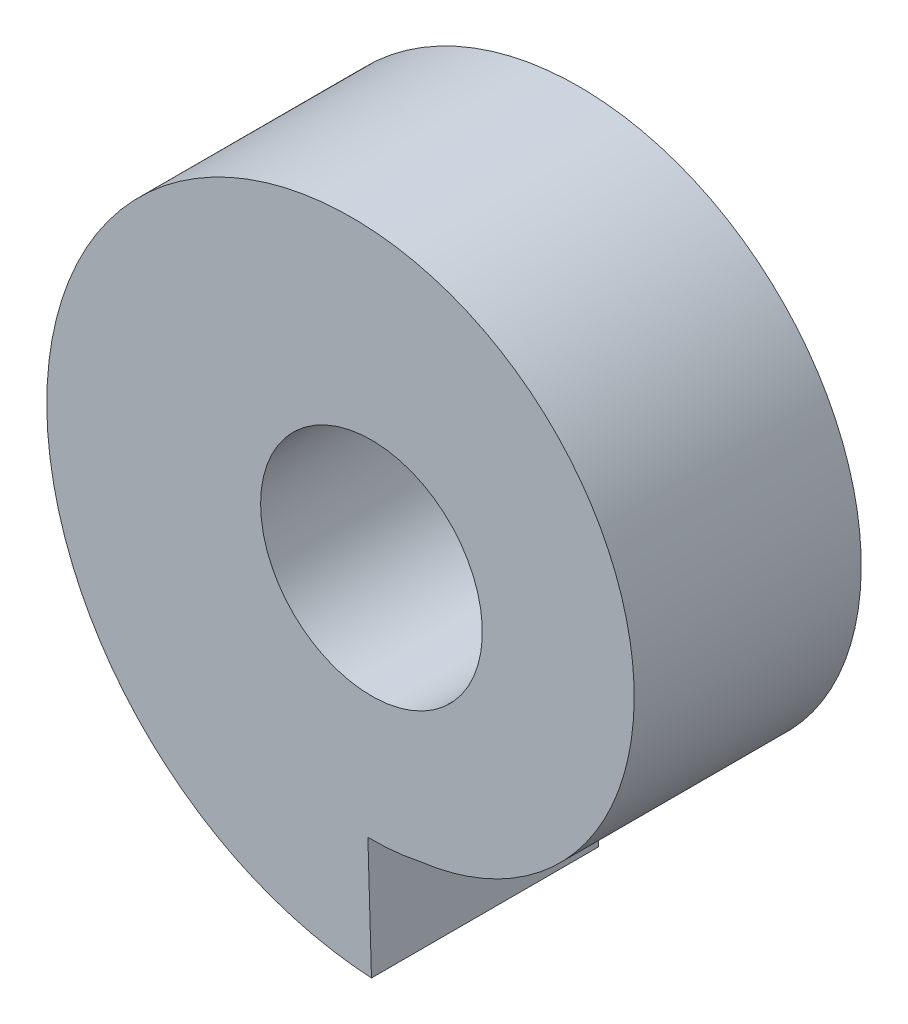
ISO-10303-21;
HEADER;
FILE_DESCRIPTION(('STEP AP214'),'2;1');
FILE_NAME('part.step','',(''),(''),'','','');
FILE_SCHEMA(('AUTOMOTIVE_DESIGN { 1 0 10303 214 1 1 1 1 }'));
ENDSEC;
DATA;
#1=APPLICATION_CONTEXT('core data for automotive mechanical design processes');
#2=APPLICATION_PROTOCOL_DEFINITION('international standard','automotive_design',2000,#1);
#3=PRODUCT_CONTEXT('',#1,'mechanical');
#4=PRODUCT('Part','Part','',(#3));
#5=PRODUCT_RELATED_PRODUCT_CATEGORY('part','',(#4));
#6=PRODUCT_DEFINITION_FORMATION('','',#4);
#7=PRODUCT_DEFINITION_CONTEXT('part definition',#1,'design');
#8=PRODUCT_DEFINITION('design','',#6,#7);
#9=PRODUCT_DEFINITION_SHAPE('','',#8);
#10=(LENGTH_UNIT() NAMED_UNIT(*) SI_UNIT(.MILLI.,.METRE.));
#11=(NAMED_UNIT(*) PLANE_ANGLE_UNIT() SI_UNIT($,.RADIAN.));
#12=(NAMED_UNIT(*) SI_UNIT($,.STERADIAN.) SOLID_ANGLE_UNIT());
#13=UNCERTAINTY_MEASURE_WITH_UNIT(LENGTH_MEASURE(1.E-05),#10,'distance_accuracy_value','');
#14=(GEOMETRIC_REPRESENTATION_CONTEXT(3) GLOBAL_UNCERTAINTY_ASSIGNED_CONTEXT((#13)) GLOBAL_UNIT_ASSIGNED_CONTEXT((#10,
#11,#12)) REPRESENTATION_CONTEXT('',''));
#15=CARTESIAN_POINT('',(0.,0.,0.));
#16=DIRECTION('',(0.,0.,1.));
#17=DIRECTION('',(1.,0.,0.));
#18=AXIS2_PLACEMENT_3D('',#15,#16,#17);
#19=CARTESIAN_POINT('',(-0.158316442824437,-26.1424127024881,0.));
#20=DIRECTION('',(-0.999556864278868,-0.0297670131688876,0.));
#21=DIRECTION('',(0.0297670131688876,-0.999556864278868,0.));
#22=AXIS2_PLACEMENT_3D('',#19,#20,#21);
#23=PLANE('',#22);
#24=DIRECTION('',(-0.0297670131688876,0.999556864278868,0.));
#25=VECTOR('',#24,1.);
#26=CARTESIAN_POINT('',(-0.158316442824437,-26.1424127024881,0.));
#27=LINE('',#26,#25);
#28=CARTESIAN_POINT('',(0.,-31.4585754715082,0.));
#29=VERTEX_POINT('',#28);
#30=CARTESIAN_POINT('',(-0.316632885648866,-20.826249933468,0.));
#31=VERTEX_POINT('',#30);
#32=EDGE_CURVE('E63',#29,#31,#27,.T.);
#33=ORIENTED_EDGE('',*,*,#32,.T.);
#34=DIRECTION('',(0.,0.,1.));
#35=VECTOR('',#34,1.);
#36=CARTESIAN_POINT('',(-0.316632885648866,-20.826249933468,10.0559952540488));
#37=LINE('',#36,#35);
#38=CARTESIAN_POINT('',(-0.316632885648866,-20.826249933468,20.1119905080975));
#39=VERTEX_POINT('',#38);
#40=EDGE_CURVE('E88',#31,#39,#37,.T.);
#41=ORIENTED_EDGE('',*,*,#40,.T.);
#42=DIRECTION('',(0.0297670131688876,-0.999556864278868,0.));
#43=VECTOR('',#42,1.);
#44=CARTESIAN_POINT('',(-0.158316442824437,-26.1424127024881,20.1119905080975));
#45=LINE('',#44,#43);
#46=CARTESIAN_POINT('',(0.,-31.4585754715082,20.1119905080975));
#47=VERTEX_POINT('',#46);
#48=EDGE_CURVE('E94',#39,#47,#45,.T.);
#49=ORIENTED_EDGE('',*,*,#48,.T.);
#50=DIRECTION('',(0.,0.,-1.));
#51=VECTOR('',#50,1.);
#52=CARTESIAN_POINT('',(0.,-31.4585754715082,10.0559952540488));
#53=LINE('',#52,#51);
#54=EDGE_CURVE('E105',#47,#29,#53,.T.);
#55=ORIENTED_EDGE('',*,*,#54,.T.);
#56=EDGE_LOOP('',(#33,#41,#49,#55));
#57=FACE_BOUND('',#56,.T.);
#58=ADVANCED_FACE('F55',(#57),#23,.F.);
#59=CARTESIAN_POINT('',(0.,-20.4585754715082,0.));
#60=DIRECTION('',(0.,0.,-1.));
#61=DIRECTION('',(0.,1.,0.));
#62=AXIS2_PLACEMENT_3D('',#59,#60,#61);
#63=PLANE('',#62);
#64=CARTESIAN_POINT('',(0.,0.,0.));
#65=DIRECTION('',(0.,0.,-1.));
#66=DIRECTION('',(-1.,0.,0.));
#67=AXIS2_PLACEMENT_3D('',#64,#65,#66);
#68=CIRCLE('',#67,9.82153628143578);
#69=CARTESIAN_POINT('',(-9.82153628143578,0.,0.));
#70=VERTEX_POINT('',#69);
#71=EDGE_CURVE('E91',#70,#70,#68,.T.);
#72=ORIENTED_EDGE('',*,*,#71,.F.);
#73=EDGE_LOOP('',(#72));
#74=FACE_BOUND('',#73,.T.);
#75=CARTESIAN_POINT('',(0.,-20.4585754715082,0.));
#76=CARTESIAN_POINT('',(1.33901062639354,-20.573158804314,0.));
#77=CARTESIAN_POINT('',(2.70063028049049,-20.5558502085192,0.));
#78=CARTESIAN_POINT('',(5.41603446935119,-20.2493790327056,0.));
#79=CARTESIAN_POINT('',(6.76974749594372,-19.9602018280232,0.));
#80=CARTESIAN_POINT('',(9.41475798903226,-19.1126508141075,0.));
#81=CARTESIAN_POINT('',(10.7059814424062,-18.554277039971,0.));
#82=CARTESIAN_POINT('',(13.1722332471065,-17.1819966665176,0.));
#83=CARTESIAN_POINT('',(14.3471880889535,-16.3681051587507,0.));
#84=CARTESIAN_POINT('',(16.53015045795,-14.5092333881527,0.));
#85=CARTESIAN_POINT('',(17.5380880452848,-13.4642830544328,0.));
#86=CARTESIAN_POINT('',(19.3414563781198,-11.1778407054819,0.));
#87=CARTESIAN_POINT('',(20.1368237481293,-9.93639261384188,0.));
#88=CARTESIAN_POINT('',(21.4766976084074,-7.3004923101381,0.));
#89=CARTESIAN_POINT('',(22.0211500838885,-5.90609656947934,0.));
#90=CARTESIAN_POINT('',(22.8298184389997,-3.01531575867887,0.));
#91=CARTESIAN_POINT('',(23.0939921413775,-1.51899770384918,0.));
#92=CARTESIAN_POINT('',(23.3231588016389,1.51899770384918,0.));
#93=CARTESIAN_POINT('',(23.2881234664431,3.06059998804408,0.));
#94=CARTESIAN_POINT('',(22.9114248169995,6.1290615328863,0.));
#95=CARTESIAN_POINT('',(22.5697486152794,7.65584055623232,0.));
#96=CARTESIAN_POINT('',(21.5844414556634,10.6334238067516,0.));
#97=CARTESIAN_POINT('',(20.940813936978,12.0841457960559,0.));
#98=CARTESIAN_POINT('',(19.3685426371745,14.8497051750646,0.));
#99=CARTESIAN_POINT('',(18.4399188909367,16.1644616527378,0.));
#100=CARTESIAN_POINT('',(16.3265069524927,18.6019641906916,0.));
#101=CARTESIAN_POINT('',(15.1417549819537,19.7246340152877,0.));
#102=CARTESIAN_POINT('',(12.5560050595688,21.7279932757808,0.));
#103=CARTESIAN_POINT('',(11.1550584312557,22.6086143889621,0.));
#104=CARTESIAN_POINT('',(8.18658537073227,24.0862443963868,0.));
#105=CARTESIAN_POINT('',(6.61912363285514,24.6831958674133,0.));
#106=CARTESIAN_POINT('',(3.37528546639179,25.5620916976927,0.));
#107=CARTESIAN_POINT('',(1.69898478300544,25.8439921410264,0.));
#108=CARTESIAN_POINT('',(-1.69898478300543,26.07315880199,0.));
#109=CARTESIAN_POINT('',(-3.42056969562371,26.0203967244553,0.));
#110=CARTESIAN_POINT('',(-6.84208859639539,25.573470601205,0.));
#111=CARTESIAN_POINT('',(-8.54193361656526,25.1792954026169,0.));
#112=CARTESIAN_POINT('',(-11.8520896244267,24.056232097138,0.));
#113=CARTESIAN_POINT('',(-13.4623101497582,23.3273508340499,0.));
#114=CARTESIAN_POINT('',(-16.5271771029702,21.5550886077667,0.));
#115=CARTESIAN_POINT('',(-17.9817352165892,20.5117326231733,0.));
#116=CARTESIAN_POINT('',(-20.6737779233663,18.1437805167821,0.));
#117=CARTESIAN_POINT('',(-21.9111799853602,16.8192269095097,0.));
#118=CARTESIAN_POINT('',(-24.1145301733723,13.9341694136206,0.));
#119=CARTESIAN_POINT('',(-25.0804050298658,12.3737242486892,0.));
#120=CARTESIAN_POINT('',(-26.6957911842951,9.07267843130676,0.));
#121=CARTESIAN_POINT('',(-27.3452416510114,7.33215069623305,0.));
#122=CARTESIAN_POINT('',(-28.2943649563123,3.7352551741026,0.));
#123=CARTESIAN_POINT('',(-28.5939921407521,1.87897186215318,0.));
#124=CARTESIAN_POINT('',(-28.8231588022643,-1.87897186215317,0.));
#125=CARTESIAN_POINT('',(-28.7526699825232,-3.78053940322552,0.));
#126=CARTESIAN_POINT('',(-28.2355163853549,-7.55511565988227,0.));
#127=CARTESIAN_POINT('',(-27.7888421900004,-9.42802667692492,0.));
#128=CARTESIAN_POINT('',(-26.5280227385665,-13.070755442075,0.));
#129=CARTESIAN_POINT('',(-25.7138877311699,-14.8404745035027,0.));
#130=CARTESIAN_POINT('',(-23.7416345783107,-18.2046490308334,0.));
#131=CARTESIAN_POINT('',(-22.5835463554478,-19.7990087804829,0.));
#132=CARTESIAN_POINT('',(-19.9610540810337,-22.7455916559985,0.));
#133=CARTESIAN_POINT('',(-18.4966988370923,-24.0977259554937,0.));
#134=CARTESIAN_POINT('',(-15.3123337676459,-26.5010670709028,0.));
#135=CARTESIAN_POINT('',(-13.5923900661369,-27.5521956708191,0.));
#136=CARTESIAN_POINT('',(-9.95877149186708,-29.3053379721539,0.));
#137=CARTESIAN_POINT('',(-8.0451777596185,-30.007287434663,0.));
#138=CARTESIAN_POINT('',(-4.09522488180585,-31.0266382148785,0.));
#139=CARTESIAN_POINT('',(-2.05895894374013,-31.3439921383429,0.));
#140=CARTESIAN_POINT('',(0.,-31.4585754715082,0.));
#141=B_SPLINE_CURVE_WITH_KNOTS('',3,(#75,#76,#77,#78,#79,#80,#81,#82,#83,#84,#85,#86,#87,#88,
#89,#90,#91,#92,#93,#94,#95,#96,#97,#98,#99,#100,#101,#102,#103,#104,#105,#106,#107,#108,#109,
#110,#111,#112,#113,#114,#115,#116,#117,#118,#119,#120,#121,#122,#123,#124,#125,#126,#127,#128,
#129,#130,#131,#132,#133,#134,#135,#136,#137,#138,#139,#140),.UNSPECIFIED.,.F.,.F.,(4,2,2,2,2,2,
2,2,2,2,2,2,2,2,2,2,2,2,2,2,2,2,2,2,2,2,2,2,2,2,2,2,4),(0.,0.03125,0.0625,0.09375,0.125,0.15625,
0.1875,0.21875,0.25,0.28125,0.3125,0.34375,0.375,0.40625,0.4375,0.46875,0.5,0.53125,0.5625,
0.59375,0.625,0.65625,0.6875,0.71875,0.75,0.78125,0.8125,0.84375,0.875,0.90625,0.9375,0.96875,
1.),.UNSPECIFIED.);
#142=CARTESIAN_POINT('',(4.37032876876348,-20.3649986282462,0.));
#143=VERTEX_POINT('',#142);
#144=EDGE_CURVE('E107',#143,#29,#141,.T.);
#145=ORIENTED_EDGE('',*,*,#144,.F.);
#146=CARTESIAN_POINT('',(0.,0.,0.));
#147=DIRECTION('',(0.,0.,-1.));
#148=DIRECTION('',(-1.,0.,0.));
#149=AXIS2_PLACEMENT_3D('',#146,#147,#148);
#150=CIRCLE('',#149,20.8286567659931);
#151=EDGE_CURVE('E125',#143,#31,#150,.T.);
#152=ORIENTED_EDGE('',*,*,#151,.T.);
#153=ORIENTED_EDGE('',*,*,#32,.F.);
#154=EDGE_LOOP('',(#145,#152,#153));
#155=FACE_BOUND('',#154,.T.);
#156=ADVANCED_FACE('F124',(#74,#155),#63,.T.);
#157=CARTESIAN_POINT('',(0.,-9.82153628143578,20.1119905080975));
#158=DIRECTION('',(0.,0.,1.));
#159=DIRECTION('',(0.,-1.,0.));
#160=AXIS2_PLACEMENT_3D('',#157,#158,#159);
#161=PLANE('',#160);
#162=ORIENTED_EDGE('',*,*,#48,.F.);
#163=CARTESIAN_POINT('',(0.,0.,20.1119905080975));
#164=DIRECTION('',(0.,0.,1.));
#165=DIRECTION('',(1.,0.,0.));
#166=AXIS2_PLACEMENT_3D('',#163,#164,#165);
#167=CIRCLE('',#166,20.8286567659931);
#168=CARTESIAN_POINT('',(4.37032876876415,-20.3649986282461,20.1119905080975));
#169=VERTEX_POINT('',#168);
#170=EDGE_CURVE('E70',#169,#39,#167,.F.);
#171=ORIENTED_EDGE('',*,*,#170,.F.);
#172=CARTESIAN_POINT('',(0.,-20.4585754715082,20.1119905080975));
#173=CARTESIAN_POINT('',(1.33901062639354,-20.573158804314,20.1119905080975));
#174=CARTESIAN_POINT('',(2.70063028049049,-20.5558502085192,20.1119905080975));
#175=CARTESIAN_POINT('',(5.41603446935119,-20.2493790327056,20.1119905080975));
#176=CARTESIAN_POINT('',(6.76974749594372,-19.9602018280233,20.1119905080975));
#177=CARTESIAN_POINT('',(9.41475798903226,-19.1126508141075,20.1119905080975));
#178=CARTESIAN_POINT('',(10.7059814424062,-18.5542770399685,20.1119905080975));
#179=CARTESIAN_POINT('',(13.1722332471065,-17.18199666652,20.1119905080975));
#180=CARTESIAN_POINT('',(14.3471880889535,-16.3681051587507,20.1119905080975));
#181=CARTESIAN_POINT('',(16.53015045795,-14.5092333881527,20.1119905080975));
#182=CARTESIAN_POINT('',(17.5380880452848,-13.4642830544328,20.1119905080975));
#183=CARTESIAN_POINT('',(19.3414563781198,-11.1778407054819,20.1119905080975));
#184=CARTESIAN_POINT('',(20.1368237481294,-9.93639261383931,20.1119905080975));
#185=CARTESIAN_POINT('',(21.4766976084074,-7.30049231014066,20.1119905080975));
#186=CARTESIAN_POINT('',(22.0211500838885,-5.90609656947999,20.1119905080975));
#187=CARTESIAN_POINT('',(22.8298184389997,-3.01531575867822,20.1119905080975));
#188=CARTESIAN_POINT('',(23.0939921413775,-1.5189977038492,20.1119905080975));
#189=CARTESIAN_POINT('',(23.3231588016389,1.5189977038492,20.1119905080975));
#190=CARTESIAN_POINT('',(23.2881234664431,3.06059998804342,20.1119905080975));
#191=CARTESIAN_POINT('',(22.9114248169995,6.12906153288697,20.1119905080975));
#192=CARTESIAN_POINT('',(22.5697486152794,7.65584055623232,20.1119905080975));
#193=CARTESIAN_POINT('',(21.5844414556634,10.6334238067516,20.1119905080975));
#194=CARTESIAN_POINT('',(20.940813936978,12.0841457960546,20.1119905080975));
#195=CARTESIAN_POINT('',(19.3685426371745,14.849705175066,20.1119905080975));
#196=CARTESIAN_POINT('',(18.439918890934,16.1644616527378,20.1119905080975));
#197=CARTESIAN_POINT('',(16.3265069524955,18.6019641906916,20.1119905080975));
#198=CARTESIAN_POINT('',(15.1417549819537,19.7246340152877,20.1119905080975));
#199=CARTESIAN_POINT('',(12.5560050595688,21.7279932757808,20.1119905080975));
#200=CARTESIAN_POINT('',(11.1550584312557,22.608614388965,20.1119905080975));
#201=CARTESIAN_POINT('',(8.18658537073227,24.0862443963839,20.1119905080975));
#202=CARTESIAN_POINT('',(6.61912363285441,24.6831958674133,20.1119905080975));
#203=CARTESIAN_POINT('',(3.37528546639252,25.5620916976927,20.1119905080975));
#204=CARTESIAN_POINT('',(1.69898478300544,25.8439921410264,20.1119905080975));
#205=CARTESIAN_POINT('',(-1.69898478300543,26.07315880199,20.1119905080975));
#206=CARTESIAN_POINT('',(-3.42056969562371,26.0203967244554,20.1119905080975));
#207=CARTESIAN_POINT('',(-6.84208859639539,25.573470601205,20.1119905080975));
#208=CARTESIAN_POINT('',(-8.54193361656526,25.1792954026169,20.1119905080975));
#209=CARTESIAN_POINT('',(-11.8520896244267,24.056232097138,20.1119905080975));
#210=CARTESIAN_POINT('',(-13.4623101497567,23.3273508340499,20.1119905080975));
#211=CARTESIAN_POINT('',(-16.5271771029717,21.5550886077667,20.1119905080975));
#212=CARTESIAN_POINT('',(-17.9817352165892,20.5117326231702,20.1119905080975));
#213=CARTESIAN_POINT('',(-20.6737779233663,18.1437805167853,20.1119905080975));
#214=CARTESIAN_POINT('',(-21.9111799853634,16.8192269095097,20.1119905080975));
#215=CARTESIAN_POINT('',(-24.1145301733692,13.9341694136207,20.1119905080975));
#216=CARTESIAN_POINT('',(-25.0804050298659,12.3737242486908,20.1119905080975));
#217=CARTESIAN_POINT('',(-26.6957911842951,9.07267843130517,20.1119905080975));
#218=CARTESIAN_POINT('',(-27.3452416510114,7.33215069623385,20.1119905080975));
#219=CARTESIAN_POINT('',(-28.2943649563123,3.73525517410179,20.1119905080975));
#220=CARTESIAN_POINT('',(-28.5939921407521,1.87897186215318,20.1119905080975));
#221=CARTESIAN_POINT('',(-28.8231588022643,-1.87897186215317,20.1119905080975));
#222=CARTESIAN_POINT('',(-28.7526699825232,-3.78053940322552,20.1119905080975));
#223=CARTESIAN_POINT('',(-28.2355163853549,-7.55511565988227,20.1119905080975));
#224=CARTESIAN_POINT('',(-27.7888421900004,-9.42802667692325,20.1119905080975));
#225=CARTESIAN_POINT('',(-26.5280227385665,-13.0707554420767,20.1119905080975));
#226=CARTESIAN_POINT('',(-25.7138877311665,-14.8404745035061,20.1119905080975));
#227=CARTESIAN_POINT('',(-23.7416345783141,-18.2046490308301,20.1119905080975));
#228=CARTESIAN_POINT('',(-22.5835463554444,-19.7990087804863,20.1119905080975));
#229=CARTESIAN_POINT('',(-19.9610540810371,-22.7455916559951,20.1119905080975));
#230=CARTESIAN_POINT('',(-18.4966988370923,-24.0977259554937,20.1119905080975));
#231=CARTESIAN_POINT('',(-15.3123337676459,-26.5010670709028,20.1119905080975));
#232=CARTESIAN_POINT('',(-13.5923900661369,-27.5521956708191,20.1119905080975));
#233=CARTESIAN_POINT('',(-9.95877149186708,-29.3053379721539,20.1119905080975));
#234=CARTESIAN_POINT('',(-8.04517775961762,-30.007287434663,20.1119905080975));
#235=CARTESIAN_POINT('',(-4.09522488180674,-31.0266382148785,20.1119905080975));
#236=CARTESIAN_POINT('',(-2.05895894373947,-31.3439921383429,20.1119905080975));
#237=CARTESIAN_POINT('',(0.,-31.4585754715082,20.1119905080975));
#238=B_SPLINE_CURVE_WITH_KNOTS('',3,(#172,#173,#174,#175,#176,#177,#178,#179,#180,#181,#182,
#183,#184,#185,#186,#187,#188,#189,#190,#191,#192,#193,#194,#195,#196,#197,#198,#199,#200,#201,
#202,#203,#204,#205,#206,#207,#208,#209,#210,#211,#212,#213,#214,#215,#216,#217,#218,#219,#220,
#221,#222,#223,#224,#225,#226,#227,#228,#229,#230,#231,#232,#233,#234,#235,#236,#237),
.UNSPECIFIED.,.F.,.F.,(4,2,2,2,2,2,2,2,2,2,2,2,2,2,2,2,2,2,2,2,2,2,2,2,2,2,2,2,2,2,2,2,4),(0.,
0.03125,0.0625,0.09375,0.125,0.15625,0.1875,0.21875,0.25,0.28125,0.3125,0.34375,0.375,0.40625,
0.4375,0.46875,0.5,0.53125,0.5625,0.59375,0.625,0.65625,0.6875,0.71875,0.75,0.78125,0.8125,
0.84375,0.875,0.90625,0.9375,0.96875,1.),.UNSPECIFIED.);
#239=EDGE_CURVE('E73',#169,#47,#238,.T.);
#240=ORIENTED_EDGE('',*,*,#239,.T.);
#241=EDGE_LOOP('',(#162,#171,#240));
#242=FACE_BOUND('',#241,.T.);
#243=CARTESIAN_POINT('',(0.,0.,20.1119905080975));
#244=DIRECTION('',(0.,0.,1.));
#245=DIRECTION('',(1.,0.,0.));
#246=AXIS2_PLACEMENT_3D('',#243,#244,#245);
#247=CIRCLE('',#246,9.82153628143578);
#248=CARTESIAN_POINT('',(-9.82153628143578,0.,20.1119905080975));
#249=VERTEX_POINT('',#248);
#250=EDGE_CURVE('E108',#249,#249,#247,.F.);
#251=ORIENTED_EDGE('',*,*,#250,.T.);
#252=EDGE_LOOP('',(#251));
#253=FACE_BOUND('',#252,.T.);
#254=ADVANCED_FACE('F57',(#242,#253),#161,.T.);
#255=CARTESIAN_POINT('',(0.,-20.4585754715082,20.1119905080975));
#256=CARTESIAN_POINT('',(1.33901062639354,-20.573158804314,20.1119905080975));
#257=CARTESIAN_POINT('',(2.70063028049049,-20.5558502085192,20.1119905080975));
#258=CARTESIAN_POINT('',(5.41603446935119,-20.2493790327056,20.1119905080975));
#259=CARTESIAN_POINT('',(6.76974749594372,-19.9602018280233,20.1119905080975));
#260=CARTESIAN_POINT('',(9.41475798903226,-19.1126508141075,20.1119905080975));
#261=CARTESIAN_POINT('',(10.7059814424062,-18.5542770399685,20.1119905080975));
#262=CARTESIAN_POINT('',(13.1722332471065,-17.18199666652,20.1119905080975));
#263=CARTESIAN_POINT('',(14.3471880889535,-16.3681051587507,20.1119905080975));
#264=CARTESIAN_POINT('',(16.53015045795,-14.5092333881527,20.1119905080975));
#265=CARTESIAN_POINT('',(17.5380880452848,-13.4642830544328,20.1119905080975));
#266=CARTESIAN_POINT('',(19.3414563781198,-11.1778407054819,20.1119905080975));
#267=CARTESIAN_POINT('',(20.1368237481294,-9.93639261383931,20.1119905080975));
#268=CARTESIAN_POINT('',(21.4766976084074,-7.30049231014066,20.1119905080975));
#269=CARTESIAN_POINT('',(22.0211500838885,-5.90609656947999,20.1119905080975));
#270=CARTESIAN_POINT('',(22.8298184389997,-3.01531575867822,20.1119905080975));
#271=CARTESIAN_POINT('',(23.0939921413775,-1.5189977038492,20.1119905080975));
#272=CARTESIAN_POINT('',(23.3231588016389,1.5189977038492,20.1119905080975));
#273=CARTESIAN_POINT('',(23.2881234664431,3.06059998804342,20.1119905080975));
#274=CARTESIAN_POINT('',(22.9114248169995,6.12906153288697,20.1119905080975));
#275=CARTESIAN_POINT('',(22.5697486152794,7.65584055623232,20.1119905080975));
#276=CARTESIAN_POINT('',(21.5844414556634,10.6334238067516,20.1119905080975));
#277=CARTESIAN_POINT('',(20.940813936978,12.0841457960546,20.1119905080975));
#278=CARTESIAN_POINT('',(19.3685426371745,14.849705175066,20.1119905080975));
#279=CARTESIAN_POINT('',(18.439918890934,16.1644616527378,20.1119905080975));
#280=CARTESIAN_POINT('',(16.3265069524955,18.6019641906916,20.1119905080975));
#281=CARTESIAN_POINT('',(15.1417549819537,19.7246340152877,20.1119905080975));
#282=CARTESIAN_POINT('',(12.5560050595688,21.7279932757808,20.1119905080975));
#283=CARTESIAN_POINT('',(11.1550584312557,22.608614388965,20.1119905080975));
#284=CARTESIAN_POINT('',(8.18658537073227,24.0862443963839,20.1119905080975));
#285=CARTESIAN_POINT('',(6.61912363285441,24.6831958674133,20.1119905080975));
#286=CARTESIAN_POINT('',(3.37528546639252,25.5620916976927,20.1119905080975));
#287=CARTESIAN_POINT('',(1.69898478300544,25.8439921410264,20.1119905080975));
#288=CARTESIAN_POINT('',(-1.69898478300543,26.07315880199,20.1119905080975));
#289=CARTESIAN_POINT('',(-3.42056969562371,26.0203967244554,20.1119905080975));
#290=CARTESIAN_POINT('',(-6.84208859639539,25.573470601205,20.1119905080975));
#291=CARTESIAN_POINT('',(-8.54193361656526,25.1792954026169,20.1119905080975));
#292=CARTESIAN_POINT('',(-11.8520896244267,24.056232097138,20.1119905080975));
#293=CARTESIAN_POINT('',(-13.4623101497567,23.3273508340499,20.1119905080975));
#294=CARTESIAN_POINT('',(-16.5271771029717,21.5550886077667,20.1119905080975));
#295=CARTESIAN_POINT('',(-17.9817352165892,20.5117326231702,20.1119905080975));
#296=CARTESIAN_POINT('',(-20.6737779233663,18.1437805167853,20.1119905080975));
#297=CARTESIAN_POINT('',(-21.9111799853634,16.8192269095097,20.1119905080975));
#298=CARTESIAN_POINT('',(-24.1145301733692,13.9341694136207,20.1119905080975));
#299=CARTESIAN_POINT('',(-25.0804050298659,12.3737242486908,20.1119905080975));
#300=CARTESIAN_POINT('',(-26.6957911842951,9.07267843130517,20.1119905080975));
#301=CARTESIAN_POINT('',(-27.3452416510114,7.33215069623385,20.1119905080975));
#302=CARTESIAN_POINT('',(-28.2943649563123,3.73525517410179,20.1119905080975));
#303=CARTESIAN_POINT('',(-28.5939921407521,1.87897186215318,20.1119905080975));
#304=CARTESIAN_POINT('',(-28.8231588022643,-1.87897186215317,20.1119905080975));
#305=CARTESIAN_POINT('',(-28.7526699825232,-3.78053940322552,20.1119905080975));
#306=CARTESIAN_POINT('',(-28.2355163853549,-7.55511565988227,20.1119905080975));
#307=CARTESIAN_POINT('',(-27.7888421900004,-9.42802667692325,20.1119905080975));
#308=CARTESIAN_POINT('',(-26.5280227385665,-13.0707554420767,20.1119905080975));
#309=CARTESIAN_POINT('',(-25.7138877311665,-14.8404745035061,20.1119905080975));
#310=CARTESIAN_POINT('',(-23.7416345783141,-18.2046490308301,20.1119905080975));
#311=CARTESIAN_POINT('',(-22.5835463554444,-19.7990087804863,20.1119905080975));
#312=CARTESIAN_POINT('',(-19.9610540810371,-22.7455916559951,20.1119905080975));
#313=CARTESIAN_POINT('',(-18.4966988370923,-24.0977259554937,20.1119905080975));
#314=CARTESIAN_POINT('',(-15.3123337676459,-26.5010670709028,20.1119905080975));
#315=CARTESIAN_POINT('',(-13.5923900661369,-27.5521956708191,20.1119905080975));
#316=CARTESIAN_POINT('',(-9.95877149186708,-29.3053379721539,20.1119905080975));
#317=CARTESIAN_POINT('',(-8.04517775961762,-30.007287434663,20.1119905080975));
#318=CARTESIAN_POINT('',(-4.09522488180674,-31.0266382148785,20.1119905080975));
#319=CARTESIAN_POINT('',(-2.05895894373947,-31.3439921383429,20.1119905080975));
#320=CARTESIAN_POINT('',(0.,-31.4585754715082,20.1119905080975));
#321=CARTESIAN_POINT('',(0.,-20.4585754715082,0.));
#322=CARTESIAN_POINT('',(1.33901062639354,-20.573158804314,0.));
#323=CARTESIAN_POINT('',(2.70063028049049,-20.5558502085192,0.));
#324=CARTESIAN_POINT('',(5.41603446935119,-20.2493790327056,0.));
#325=CARTESIAN_POINT('',(6.76974749594372,-19.9602018280232,0.));
#326=CARTESIAN_POINT('',(9.41475798903226,-19.1126508141075,0.));
#327=CARTESIAN_POINT('',(10.7059814424062,-18.554277039971,0.));
#328=CARTESIAN_POINT('',(13.1722332471065,-17.1819966665176,0.));
#329=CARTESIAN_POINT('',(14.3471880889535,-16.3681051587507,0.));
#330=CARTESIAN_POINT('',(16.53015045795,-14.5092333881527,0.));
#331=CARTESIAN_POINT('',(17.5380880452848,-13.4642830544328,0.));
#332=CARTESIAN_POINT('',(19.3414563781198,-11.1778407054819,0.));
#333=CARTESIAN_POINT('',(20.1368237481293,-9.93639261384188,0.));
#334=CARTESIAN_POINT('',(21.4766976084074,-7.3004923101381,0.));
#335=CARTESIAN_POINT('',(22.0211500838885,-5.90609656947934,0.));
#336=CARTESIAN_POINT('',(22.8298184389997,-3.01531575867887,0.));
#337=CARTESIAN_POINT('',(23.0939921413775,-1.51899770384918,0.));
#338=CARTESIAN_POINT('',(23.3231588016389,1.51899770384918,0.));
#339=CARTESIAN_POINT('',(23.2881234664431,3.06059998804408,0.));
#340=CARTESIAN_POINT('',(22.9114248169995,6.1290615328863,0.));
#341=CARTESIAN_POINT('',(22.5697486152794,7.65584055623232,0.));
#342=CARTESIAN_POINT('',(21.5844414556634,10.6334238067516,0.));
#343=CARTESIAN_POINT('',(20.940813936978,12.0841457960559,0.));
#344=CARTESIAN_POINT('',(19.3685426371745,14.8497051750646,0.));
#345=CARTESIAN_POINT('',(18.4399188909367,16.1644616527378,0.));
#346=CARTESIAN_POINT('',(16.3265069524927,18.6019641906916,0.));
#347=CARTESIAN_POINT('',(15.1417549819537,19.7246340152877,0.));
#348=CARTESIAN_POINT('',(12.5560050595688,21.7279932757808,0.));
#349=CARTESIAN_POINT('',(11.1550584312557,22.6086143889621,0.));
#350=CARTESIAN_POINT('',(8.18658537073227,24.0862443963868,0.));
#351=CARTESIAN_POINT('',(6.61912363285514,24.6831958674133,0.));
#352=CARTESIAN_POINT('',(3.37528546639179,25.5620916976927,0.));
#353=CARTESIAN_POINT('',(1.69898478300544,25.8439921410264,0.));
#354=CARTESIAN_POINT('',(-1.69898478300543,26.07315880199,0.));
#355=CARTESIAN_POINT('',(-3.42056969562371,26.0203967244553,0.));
#356=CARTESIAN_POINT('',(-6.84208859639539,25.573470601205,0.));
#357=CARTESIAN_POINT('',(-8.54193361656526,25.1792954026169,0.));
#358=CARTESIAN_POINT('',(-11.8520896244267,24.056232097138,0.));
#359=CARTESIAN_POINT('',(-13.4623101497582,23.3273508340499,0.));
#360=CARTESIAN_POINT('',(-16.5271771029702,21.5550886077667,0.));
#361=CARTESIAN_POINT('',(-17.9817352165892,20.5117326231733,0.));
#362=CARTESIAN_POINT('',(-20.6737779233663,18.1437805167821,0.));
#363=CARTESIAN_POINT('',(-21.9111799853602,16.8192269095097,0.));
#364=CARTESIAN_POINT('',(-24.1145301733723,13.9341694136206,0.));
#365=CARTESIAN_POINT('',(-25.0804050298658,12.3737242486892,0.));
#366=CARTESIAN_POINT('',(-26.6957911842951,9.07267843130676,0.));
#367=CARTESIAN_POINT('',(-27.3452416510114,7.33215069623305,0.));
#368=CARTESIAN_POINT('',(-28.2943649563123,3.7352551741026,0.));
#369=CARTESIAN_POINT('',(-28.5939921407521,1.87897186215318,0.));
#370=CARTESIAN_POINT('',(-28.8231588022643,-1.87897186215317,0.));
#371=CARTESIAN_POINT('',(-28.7526699825232,-3.78053940322552,0.));
#372=CARTESIAN_POINT('',(-28.2355163853549,-7.55511565988227,0.));
#373=CARTESIAN_POINT('',(-27.7888421900004,-9.42802667692492,0.));
#374=CARTESIAN_POINT('',(-26.5280227385665,-13.070755442075,0.));
#375=CARTESIAN_POINT('',(-25.7138877311699,-14.8404745035027,0.));
#376=CARTESIAN_POINT('',(-23.7416345783107,-18.2046490308334,0.));
#377=CARTESIAN_POINT('',(-22.5835463554478,-19.7990087804829,0.));
#378=CARTESIAN_POINT('',(-19.9610540810337,-22.7455916559985,0.));
#379=CARTESIAN_POINT('',(-18.4966988370923,-24.0977259554937,0.));
#380=CARTESIAN_POINT('',(-15.3123337676459,-26.5010670709028,0.));
#381=CARTESIAN_POINT('',(-13.5923900661369,-27.5521956708191,0.));
#382=CARTESIAN_POINT('',(-9.95877149186708,-29.3053379721539,0.));
#383=CARTESIAN_POINT('',(-8.0451777596185,-30.007287434663,0.));
#384=CARTESIAN_POINT('',(-4.09522488180585,-31.0266382148785,0.));
#385=CARTESIAN_POINT('',(-2.05895894374013,-31.3439921383429,0.));
#386=CARTESIAN_POINT('',(0.,-31.4585754715082,0.));
#387=B_SPLINE_SURFACE_WITH_KNOTS('',1,3,((#255,#256,#257,#258,#259,#260,#261,#262,#263,#264,
#265,#266,#267,#268,#269,#270,#271,#272,#273,#274,#275,#276,#277,#278,#279,#280,#281,#282,#283,
#284,#285,#286,#287,#288,#289,#290,#291,#292,#293,#294,#295,#296,#297,#298,#299,#300,#301,#302,
#303,#304,#305,#306,#307,#308,#309,#310,#311,#312,#313,#314,#315,#316,#317,#318,#319,#320),
(#321,#322,#323,#324,#325,#326,#327,#328,#329,#330,#331,#332,#333,#334,#335,#336,#337,#338,#339,
#340,#341,#342,#343,#344,#345,#346,#347,#348,#349,#350,#351,#352,#353,#354,#355,#356,#357,#358,
#359,#360,#361,#362,#363,#364,#365,#366,#367,#368,#369,#370,#371,#372,#373,#374,#375,#376,#377,
#378,#379,#380,#381,#382,#383,#384,#385,#386)),.UNSPECIFIED.,.F.,.F.,.F.,(2,2),(4,2,2,2,2,2,2,2,
2,2,2,2,2,2,2,2,2,2,2,2,2,2,2,2,2,2,2,2,2,2,2,2,4),(0.672965444673942,1.),(0.,0.03125,0.0625,
0.09375,0.125,0.15625,0.1875,0.21875,0.25,0.28125,0.3125,0.34375,0.375,0.40625,0.4375,0.46875,
0.5,0.53125,0.5625,0.59375,0.625,0.65625,0.6875,0.71875,0.75,0.78125,0.8125,0.84375,0.875,
0.90625,0.9375,0.96875,1.),.UNSPECIFIED.);
#388=DIRECTION('',(0.,0.,-1.));
#389=VECTOR('',#388,1.);
#390=CARTESIAN_POINT('',(4.37032876876345,-20.3649986282462,10.0559952540488));
#391=LINE('',#390,#389);
#392=EDGE_CURVE('E13',#143,#169,#391,.F.);
#393=ORIENTED_EDGE('',*,*,#392,.F.);
#394=ORIENTED_EDGE('',*,*,#144,.T.);
#395=ORIENTED_EDGE('',*,*,#54,.F.);
#396=ORIENTED_EDGE('',*,*,#239,.F.);
#397=EDGE_LOOP('',(#393,#394,#395,#396));
#398=FACE_BOUND('',#397,.T.);
#399=ADVANCED_FACE('F122',(#398),#387,.T.);
#400=CARTESIAN_POINT('',(0.,0.,79.0243282770607));
#401=DIRECTION('',(0.,0.,-1.));
#402=DIRECTION('',(-1.,0.,0.));
#403=AXIS2_PLACEMENT_3D('',#400,#401,#402);
#404=CYLINDRICAL_SURFACE('',#403,20.8286567659931);
#405=ORIENTED_EDGE('',*,*,#170,.T.);
#406=ORIENTED_EDGE('',*,*,#40,.F.);
#407=ORIENTED_EDGE('',*,*,#151,.F.);
#408=ORIENTED_EDGE('',*,*,#392,.T.);
#409=EDGE_LOOP('',(#405,#406,#407,#408));
#410=FACE_BOUND('',#409,.T.);
#411=ADVANCED_FACE('F86',(#410),#404,.T.);
#412=CARTESIAN_POINT('',(0.,0.,79.0243282770607));
#413=DIRECTION('',(0.,0.,-1.));
#414=DIRECTION('',(-1.,0.,0.));
#415=AXIS2_PLACEMENT_3D('',#412,#413,#414);
#416=CYLINDRICAL_SURFACE('',#415,9.82153628143578);
#417=CARTESIAN_POINT('',(-9.82153628143578,0.,0.));
#418=CARTESIAN_POINT('',(-9.82153628143578,0.,0.209499901126027));
#419=CARTESIAN_POINT('',(-9.82153628143578,0.,0.418999802252041));
#420=CARTESIAN_POINT('',(-9.82153628143578,0.,0.837999604504073));
#421=CARTESIAN_POINT('',(-9.82153628143578,0.,1.04749950563009));
#422=CARTESIAN_POINT('',(-9.82153628143578,0.,1.46649930788212));
#423=CARTESIAN_POINT('',(-9.82153628143578,0.,1.67599920900814));
#424=CARTESIAN_POINT('',(-9.82153628143578,0.,2.09499901126017));
#425=CARTESIAN_POINT('',(-9.82153628143578,0.,2.30449891238619));
#426=CARTESIAN_POINT('',(-9.82153628143578,0.,2.72349871463822));
#427=CARTESIAN_POINT('',(-9.82153628143578,0.,2.93299861576423));
#428=CARTESIAN_POINT('',(-9.82153628143578,0.,3.35199841801626));
#429=CARTESIAN_POINT('',(-9.82153628143578,0.,3.56149831914228));
#430=CARTESIAN_POINT('',(-9.82153628143578,0.,3.98049812139431));
#431=CARTESIAN_POINT('',(-9.82153628143578,0.,4.18999802252033));
#432=CARTESIAN_POINT('',(-9.82153628143578,0.,4.60899782477236));
#433=CARTESIAN_POINT('',(-9.82153628143578,0.,4.81849772589838));
#434=CARTESIAN_POINT('',(-9.82153628143578,0.,5.23749752815041));
#435=CARTESIAN_POINT('',(-9.82153628143578,0.,5.44699742927642));
#436=CARTESIAN_POINT('',(-9.82153628143578,0.,5.86599723152846));
#437=CARTESIAN_POINT('',(-9.82153628143578,0.,6.07549713265447));
#438=CARTESIAN_POINT('',(-9.82153628143578,0.,6.49449693490651));
#439=CARTESIAN_POINT('',(-9.82153628143578,0.,6.70399683603252));
#440=CARTESIAN_POINT('',(-9.82153628143578,0.,7.12299663828455));
#441=CARTESIAN_POINT('',(-9.82153628143578,0.,7.33249653941057));
#442=CARTESIAN_POINT('',(-9.82153628143578,0.,7.7514963416626));
#443=CARTESIAN_POINT('',(-9.82153628143578,0.,7.96099624278862));
#444=CARTESIAN_POINT('',(-9.82153628143578,0.,8.37999604504064));
#445=CARTESIAN_POINT('',(-9.82153628143578,0.,8.58949594616666));
#446=CARTESIAN_POINT('',(-9.82153628143578,0.,9.00849574841869));
#447=CARTESIAN_POINT('',(-9.82153628143578,0.,9.21799564954471));
#448=CARTESIAN_POINT('',(-9.82153628143578,0.,9.63699545179674));
#449=CARTESIAN_POINT('',(-9.82153628143578,0.,9.84649535292276));
#450=CARTESIAN_POINT('',(-9.82153628143578,0.,10.2654951551748));
#451=CARTESIAN_POINT('',(-9.82153628143578,0.,10.4749950563008));
#452=CARTESIAN_POINT('',(-9.82153628143578,0.,10.8939948585528));
#453=CARTESIAN_POINT('',(-9.82153628143578,0.,11.1034947596788));
#454=CARTESIAN_POINT('',(-9.82153628143578,0.,11.5224945619309));
#455=CARTESIAN_POINT('',(-9.82153628143578,0.,11.7319944630569));
#456=CARTESIAN_POINT('',(-9.82153628143578,0.,12.1509942653089));
#457=CARTESIAN_POINT('',(-9.82153628143578,0.,12.3604941664349));
#458=CARTESIAN_POINT('',(-9.82153628143578,0.,12.779493968687));
#459=CARTESIAN_POINT('',(-9.82153628143578,0.,12.988993869813));
#460=CARTESIAN_POINT('',(-9.82153628143578,0.,13.407993672065));
#461=CARTESIAN_POINT('',(-9.82153628143578,0.,13.617493573191));
#462=CARTESIAN_POINT('',(-9.82153628143578,0.,14.0364933754431));
#463=CARTESIAN_POINT('',(-9.82153628143578,0.,14.2459932765691));
#464=CARTESIAN_POINT('',(-9.82153628143578,0.,14.6649930788211));
#465=CARTESIAN_POINT('',(-9.82153628143578,0.,14.8744929799471));
#466=CARTESIAN_POINT('',(-9.82153628143578,0.,15.2934927821992));
#467=CARTESIAN_POINT('',(-9.82153628143578,0.,15.5029926833252));
#468=CARTESIAN_POINT('',(-9.82153628143578,0.,15.9219924855772));
#469=CARTESIAN_POINT('',(-9.82153628143578,0.,16.1314923867032));
#470=CARTESIAN_POINT('',(-9.82153628143578,0.,16.5504921889553));
#471=CARTESIAN_POINT('',(-9.82153628143578,0.,16.7599920900813));
#472=CARTESIAN_POINT('',(-9.82153628143578,0.,17.1789918923333));
#473=CARTESIAN_POINT('',(-9.82153628143578,0.,17.3884917934593));
#474=CARTESIAN_POINT('',(-9.82153628143578,0.,17.8074915957114));
#475=CARTESIAN_POINT('',(-9.82153628143578,0.,18.0169914968374));
#476=CARTESIAN_POINT('',(-9.82153628143578,0.,18.4359912990894));
#477=CARTESIAN_POINT('',(-9.82153628143578,0.,18.6454912002154));
#478=CARTESIAN_POINT('',(-9.82153628143578,0.,19.0644910024674));
#479=CARTESIAN_POINT('',(-9.82153628143578,0.,19.2739909035935));
#480=CARTESIAN_POINT('',(-9.82153628143578,0.,19.6929907058455));
#481=CARTESIAN_POINT('',(-9.82153628143578,0.,19.9024906069715));
#482=CARTESIAN_POINT('',(-9.82153628143578,0.,20.1119905080975));
#483=B_SPLINE_CURVE_WITH_KNOTS('',3,(#417,#418,#419,#420,#421,#422,#423,#424,#425,#426,#427,
#428,#429,#430,#431,#432,#433,#434,#435,#436,#437,#438,#439,#440,#441,#442,#443,#444,#445,#446,
#447,#448,#449,#450,#451,#452,#453,#454,#455,#456,#457,#458,#459,#460,#461,#462,#463,#464,#465,
#466,#467,#468,#469,#470,#471,#472,#473,#474,#475,#476,#477,#478,#479,#480,#481,#482),
.UNSPECIFIED.,.F.,.F.,(4,2,2,2,2,2,2,2,2,2,2,2,2,2,2,2,2,2,2,2,2,2,2,2,2,2,2,2,2,2,2,2,4),(0.,
0.628499703378041,1.2569994067561,1.88549911013414,2.51399881351219,3.14249851689023,
3.77099822026829,4.39949792364633,5.02799762702438,5.65649733040242,6.28499703378048,
6.91349673715852,7.54199644053657,8.17049614391462,8.79899584729266,9.42749555067071,
10.0559952540488,10.6844949574268,11.3129946608048,11.9414943641829,12.5699940675609,
13.198493770939,13.826993474317,14.4554931776951,15.0839928810731,15.7124925844512,
16.3409922878292,16.9694919912073,17.5979916945853,18.2264913979634,18.8549911013414,
19.4834908047195,20.1119905080975),.UNSPECIFIED.);
#484=EDGE_CURVE('BSEAM132',#70,#249,#483,.T.);
#485=ORIENTED_EDGE('',*,*,#71,.T.);
#486=ORIENTED_EDGE('',*,*,#250,.F.);
#487=ORIENTED_EDGE('',*,*,#484,.T.);
#488=ORIENTED_EDGE('',*,*,#484,.F.);
#489=EDGE_LOOP('',(#485,#487,#486,#488));
#490=FACE_BOUND('',#489,.T.);
#491=ADVANCED_FACE('F132',(#490),#416,.F.);
#492=CLOSED_SHELL('',(#58,#156,#254,#399,#411,#491));
#493=MANIFOLD_SOLID_BREP('B2',#492);
#494=ADVANCED_BREP_SHAPE_REPRESENTATION('',(#18,#493),#14);
#495=SHAPE_DEFINITION_REPRESENTATION(#9,#494);
ENDSEC;
END-ISO-10303-21;
